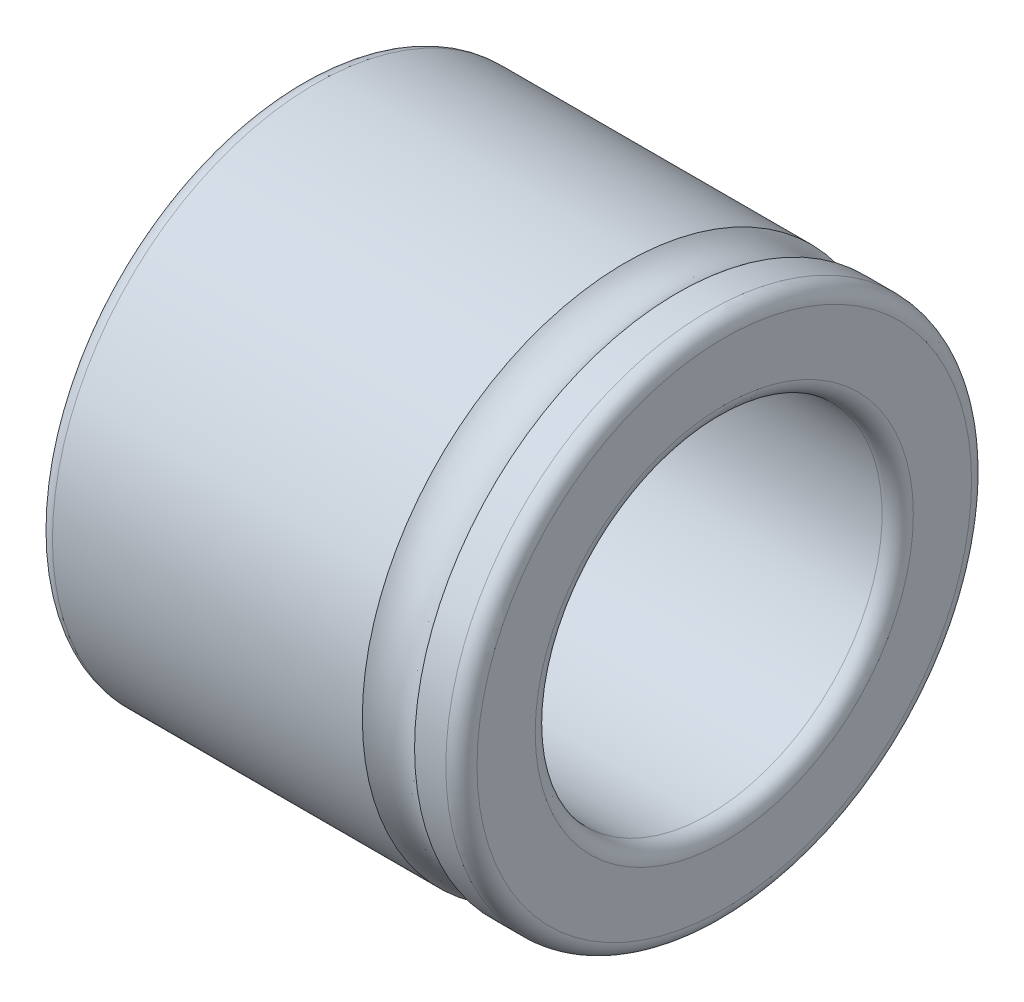
ISO-10303-21;
HEADER;
FILE_DESCRIPTION(('STEP AP214'),'2;1');
FILE_NAME('part.step','',(''),(''),'','','');
FILE_SCHEMA(('AUTOMOTIVE_DESIGN { 1 0 10303 214 1 1 1 1 }'));
ENDSEC;
DATA;
#1=APPLICATION_CONTEXT('core data for automotive mechanical design processes');
#2=APPLICATION_PROTOCOL_DEFINITION('international standard','automotive_design',2000,#1);
#3=PRODUCT_CONTEXT('',#1,'mechanical');
#4=PRODUCT('Part','Part','',(#3));
#5=PRODUCT_RELATED_PRODUCT_CATEGORY('part','',(#4));
#6=PRODUCT_DEFINITION_FORMATION('','',#4);
#7=PRODUCT_DEFINITION_CONTEXT('part definition',#1,'design');
#8=PRODUCT_DEFINITION('design','',#6,#7);
#9=PRODUCT_DEFINITION_SHAPE('','',#8);
#10=(LENGTH_UNIT() NAMED_UNIT(*) SI_UNIT(.MILLI.,.METRE.));
#11=(NAMED_UNIT(*) PLANE_ANGLE_UNIT() SI_UNIT($,.RADIAN.));
#12=(NAMED_UNIT(*) SI_UNIT($,.STERADIAN.) SOLID_ANGLE_UNIT());
#13=UNCERTAINTY_MEASURE_WITH_UNIT(LENGTH_MEASURE(1.E-05),#10,'distance_accuracy_value','');
#14=(GEOMETRIC_REPRESENTATION_CONTEXT(3) GLOBAL_UNCERTAINTY_ASSIGNED_CONTEXT((#13)) GLOBAL_UNIT_ASSIGNED_CONTEXT((#10,
#11,#12)) REPRESENTATION_CONTEXT('',''));
#15=CARTESIAN_POINT('',(0.,0.,0.));
#16=DIRECTION('',(0.,0.,1.));
#17=DIRECTION('',(1.,0.,0.));
#18=AXIS2_PLACEMENT_3D('',#15,#16,#17);
#19=CARTESIAN_POINT('',(3.,0.,0.));
#20=DIRECTION('',(-1.,0.,0.));
#21=DIRECTION('',(0.,0.,1.));
#22=AXIS2_PLACEMENT_3D('',#19,#20,#21);
#23=TOROIDAL_SURFACE('',#22,18.7,2.5);
#24=CARTESIAN_POINT('',(1.3267714591246,0.,0.));
#25=DIRECTION('',(-1.,0.,0.));
#26=DIRECTION('',(0.,0.,1.));
#27=AXIS2_PLACEMENT_3D('',#24,#25,#26);
#28=CIRCLE('',#27,16.8425);
#29=CARTESIAN_POINT('',(1.3267714591246,0.,16.8425));
#30=VERTEX_POINT('',#29);
#31=EDGE_CURVE('E10',#30,#30,#28,.T.);
#32=ORIENTED_EDGE('',*,*,#31,.F.);
#33=EDGE_LOOP('',(#32));
#34=FACE_BOUND('',#33,.T.);
#35=CARTESIAN_POINT('',(4.67322854087541,0.,0.));
#36=DIRECTION('',(-1.,0.,0.));
#37=DIRECTION('',(0.,0.,1.));
#38=AXIS2_PLACEMENT_3D('',#35,#36,#37);
#39=CIRCLE('',#38,16.8425);
#40=CARTESIAN_POINT('',(4.67322854087541,0.,16.8425));
#41=VERTEX_POINT('',#40);
#42=EDGE_CURVE('E64',#41,#41,#39,.T.);
#43=ORIENTED_EDGE('',*,*,#42,.T.);
#44=EDGE_LOOP('',(#43));
#45=FACE_BOUND('',#44,.T.);
#46=ADVANCED_FACE('F30',(#34,#45),#23,.F.);
#47=CARTESIAN_POINT('',(-23.3160565158148,0.,0.));
#48=DIRECTION('',(-1.,0.,0.));
#49=DIRECTION('',(0.,0.,1.));
#50=AXIS2_PLACEMENT_3D('',#47,#48,#49);
#51=CYLINDRICAL_SURFACE('',#50,16.8425);
#52=CARTESIAN_POINT('',(-18.5267714591246,0.,0.));
#53=DIRECTION('',(-1.,0.,0.));
#54=DIRECTION('',(0.,0.,1.));
#55=AXIS2_PLACEMENT_3D('',#52,#53,#54);
#56=CIRCLE('',#55,16.8425);
#57=CARTESIAN_POINT('',(-18.5267714591246,0.,16.8425));
#58=VERTEX_POINT('',#57);
#59=EDGE_CURVE('E36',#58,#58,#56,.T.);
#60=ORIENTED_EDGE('',*,*,#59,.F.);
#61=EDGE_LOOP('',(#60));
#62=FACE_BOUND('',#61,.T.);
#63=ORIENTED_EDGE('',*,*,#31,.T.);
#64=EDGE_LOOP('',(#63));
#65=FACE_BOUND('',#64,.T.);
#66=ADVANCED_FACE('F113',(#62,#65),#51,.T.);
#67=CARTESIAN_POINT('',(-18.5267714591246,0.,0.));
#68=DIRECTION('',(-1.,0.,0.));
#69=DIRECTION('',(0.,0.,1.));
#70=AXIS2_PLACEMENT_3D('',#67,#68,#69);
#71=TOROIDAL_SURFACE('',#70,15.8425,1.);
#72=CARTESIAN_POINT('',(-19.5267714591246,0.,0.));
#73=DIRECTION('',(-1.,0.,0.));
#74=DIRECTION('',(0.,0.,1.));
#75=AXIS2_PLACEMENT_3D('',#72,#73,#74);
#76=CIRCLE('',#75,15.8425);
#77=CARTESIAN_POINT('',(-19.5267714591246,0.,15.8425));
#78=VERTEX_POINT('',#77);
#79=EDGE_CURVE('E40',#78,#78,#76,.T.);
#80=ORIENTED_EDGE('',*,*,#79,.F.);
#81=EDGE_LOOP('',(#80));
#82=FACE_BOUND('',#81,.T.);
#83=ORIENTED_EDGE('',*,*,#59,.T.);
#84=EDGE_LOOP('',(#83));
#85=FACE_BOUND('',#84,.T.);
#86=ADVANCED_FACE('F108',(#82,#85),#71,.T.);
#87=CARTESIAN_POINT('',(-19.5267714591246,12.1125,0.));
#88=DIRECTION('',(1.,0.,0.));
#89=DIRECTION('',(0.,0.,-1.));
#90=AXIS2_PLACEMENT_3D('',#87,#88,#89);
#91=PLANE('',#90);
#92=CARTESIAN_POINT('',(-19.5267714591246,0.,0.));
#93=DIRECTION('',(-1.,0.,0.));
#94=DIRECTION('',(0.,0.,1.));
#95=AXIS2_PLACEMENT_3D('',#92,#93,#94);
#96=CIRCLE('',#95,12.1125);
#97=CARTESIAN_POINT('',(-19.5267714591246,0.,12.1125));
#98=VERTEX_POINT('',#97);
#99=EDGE_CURVE('E44',#98,#98,#96,.T.);
#100=ORIENTED_EDGE('',*,*,#99,.F.);
#101=EDGE_LOOP('',(#100));
#102=FACE_BOUND('',#101,.T.);
#103=ORIENTED_EDGE('',*,*,#79,.T.);
#104=EDGE_LOOP('',(#103));
#105=FACE_BOUND('',#104,.T.);
#106=ADVANCED_FACE('F102',(#102,#105),#91,.F.);
#107=CARTESIAN_POINT('',(-18.5267714591246,0.,0.));
#108=DIRECTION('',(-1.,0.,0.));
#109=DIRECTION('',(0.,0.,1.));
#110=AXIS2_PLACEMENT_3D('',#107,#108,#109);
#111=TOROIDAL_SURFACE('',#110,12.1125,0.999999999999999);
#112=CARTESIAN_POINT('',(-18.5267714591246,0.,0.));
#113=DIRECTION('',(-1.,0.,0.));
#114=DIRECTION('',(0.,0.,1.));
#115=AXIS2_PLACEMENT_3D('',#112,#113,#114);
#116=CIRCLE('',#115,11.1125);
#117=CARTESIAN_POINT('',(-18.5267714591246,0.,11.1125));
#118=VERTEX_POINT('',#117);
#119=EDGE_CURVE('E49',#118,#118,#116,.T.);
#120=ORIENTED_EDGE('',*,*,#119,.F.);
#121=EDGE_LOOP('',(#120));
#122=FACE_BOUND('',#121,.T.);
#123=ORIENTED_EDGE('',*,*,#99,.T.);
#124=EDGE_LOOP('',(#123));
#125=FACE_BOUND('',#124,.T.);
#126=ADVANCED_FACE('F96',(#122,#125),#111,.T.);
#127=CARTESIAN_POINT('',(-23.3160565158148,0.,0.));
#128=DIRECTION('',(-1.,0.,0.));
#129=DIRECTION('',(0.,0.,1.));
#130=AXIS2_PLACEMENT_3D('',#127,#128,#129);
#131=CYLINDRICAL_SURFACE('',#130,11.1125);
#132=CARTESIAN_POINT('',(6.6732285408754,0.,0.));
#133=DIRECTION('',(-1.,0.,0.));
#134=DIRECTION('',(0.,0.,1.));
#135=AXIS2_PLACEMENT_3D('',#132,#133,#134);
#136=CIRCLE('',#135,11.1125);
#137=CARTESIAN_POINT('',(6.6732285408754,0.,11.1125));
#138=VERTEX_POINT('',#137);
#139=EDGE_CURVE('E52',#138,#138,#136,.T.);
#140=ORIENTED_EDGE('',*,*,#139,.F.);
#141=EDGE_LOOP('',(#140));
#142=FACE_BOUND('',#141,.T.);
#143=ORIENTED_EDGE('',*,*,#119,.T.);
#144=EDGE_LOOP('',(#143));
#145=FACE_BOUND('',#144,.T.);
#146=ADVANCED_FACE('F90',(#142,#145),#131,.F.);
#147=CARTESIAN_POINT('',(6.6732285408754,0.,0.));
#148=DIRECTION('',(-1.,0.,0.));
#149=DIRECTION('',(0.,0.,1.));
#150=AXIS2_PLACEMENT_3D('',#147,#148,#149);
#151=TOROIDAL_SURFACE('',#150,12.1125,1.);
#152=CARTESIAN_POINT('',(7.6732285408754,0.,0.));
#153=DIRECTION('',(-1.,0.,0.));
#154=DIRECTION('',(0.,0.,1.));
#155=AXIS2_PLACEMENT_3D('',#152,#153,#154);
#156=CIRCLE('',#155,12.1125);
#157=CARTESIAN_POINT('',(7.6732285408754,0.,12.1125));
#158=VERTEX_POINT('',#157);
#159=EDGE_CURVE('E55',#158,#158,#156,.T.);
#160=ORIENTED_EDGE('',*,*,#159,.F.);
#161=EDGE_LOOP('',(#160));
#162=FACE_BOUND('',#161,.T.);
#163=ORIENTED_EDGE('',*,*,#139,.T.);
#164=EDGE_LOOP('',(#163));
#165=FACE_BOUND('',#164,.T.);
#166=ADVANCED_FACE('F84',(#162,#165),#151,.T.);
#167=CARTESIAN_POINT('',(7.6732285408754,12.1125,0.));
#168=DIRECTION('',(-1.,0.,0.));
#169=DIRECTION('',(0.,0.,1.));
#170=AXIS2_PLACEMENT_3D('',#167,#168,#169);
#171=PLANE('',#170);
#172=CARTESIAN_POINT('',(7.6732285408754,0.,0.));
#173=DIRECTION('',(-1.,0.,0.));
#174=DIRECTION('',(0.,0.,1.));
#175=AXIS2_PLACEMENT_3D('',#172,#173,#174);
#176=CIRCLE('',#175,15.8425);
#177=CARTESIAN_POINT('',(7.6732285408754,0.,15.8425));
#178=VERTEX_POINT('',#177);
#179=EDGE_CURVE('E58',#178,#178,#176,.T.);
#180=ORIENTED_EDGE('',*,*,#179,.F.);
#181=EDGE_LOOP('',(#180));
#182=FACE_BOUND('',#181,.T.);
#183=ORIENTED_EDGE('',*,*,#159,.T.);
#184=EDGE_LOOP('',(#183));
#185=FACE_BOUND('',#184,.T.);
#186=ADVANCED_FACE('F78',(#182,#185),#171,.F.);
#187=CARTESIAN_POINT('',(6.6732285408754,0.,0.));
#188=DIRECTION('',(-1.,0.,0.));
#189=DIRECTION('',(0.,0.,1.));
#190=AXIS2_PLACEMENT_3D('',#187,#188,#189);
#191=TOROIDAL_SURFACE('',#190,15.8425,0.999999999999999);
#192=CARTESIAN_POINT('',(6.67322854087541,0.,0.));
#193=DIRECTION('',(-1.,0.,0.));
#194=DIRECTION('',(0.,0.,1.));
#195=AXIS2_PLACEMENT_3D('',#192,#193,#194);
#196=CIRCLE('',#195,16.8425);
#197=CARTESIAN_POINT('',(6.67322854087541,0.,16.8425));
#198=VERTEX_POINT('',#197);
#199=EDGE_CURVE('E61',#198,#198,#196,.T.);
#200=ORIENTED_EDGE('',*,*,#199,.F.);
#201=EDGE_LOOP('',(#200));
#202=FACE_BOUND('',#201,.T.);
#203=ORIENTED_EDGE('',*,*,#179,.T.);
#204=EDGE_LOOP('',(#203));
#205=FACE_BOUND('',#204,.T.);
#206=ADVANCED_FACE('F72',(#202,#205),#191,.T.);
#207=CARTESIAN_POINT('',(-23.3160565158148,0.,0.));
#208=DIRECTION('',(-1.,0.,0.));
#209=DIRECTION('',(0.,0.,1.));
#210=AXIS2_PLACEMENT_3D('',#207,#208,#209);
#211=CYLINDRICAL_SURFACE('',#210,16.8425);
#212=ORIENTED_EDGE('',*,*,#42,.F.);
#213=EDGE_LOOP('',(#212));
#214=FACE_BOUND('',#213,.T.);
#215=ORIENTED_EDGE('',*,*,#199,.T.);
#216=EDGE_LOOP('',(#215));
#217=FACE_BOUND('',#216,.T.);
#218=ADVANCED_FACE('F69',(#214,#217),#211,.T.);
#219=CLOSED_SHELL('',(#46,#66,#86,#106,#126,#146,#166,#186,#206,#218));
#220=MANIFOLD_SOLID_BREP('B2',#219);
#221=ADVANCED_BREP_SHAPE_REPRESENTATION('',(#18,#220),#14);
#222=SHAPE_DEFINITION_REPRESENTATION(#9,#221);
ENDSEC;
END-ISO-10303-21;
